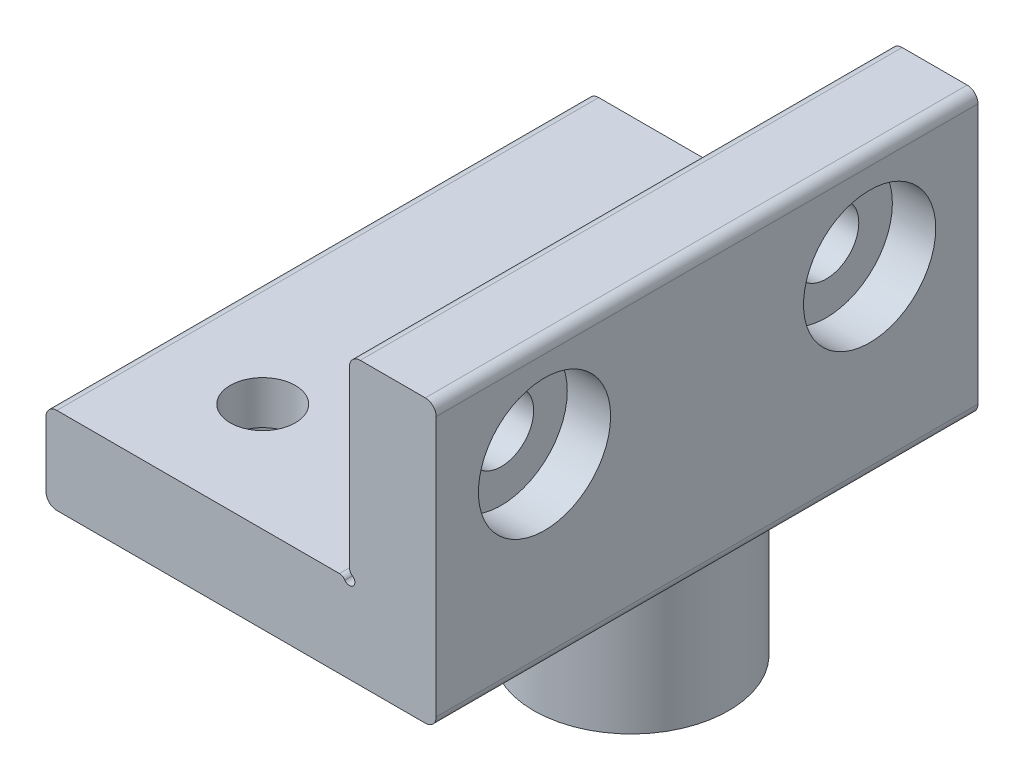
ISO-10303-21;
HEADER;
FILE_DESCRIPTION(('STEP AP214'),'2;1');
FILE_NAME('part.step','',(''),(''),'','','');
FILE_SCHEMA(('AUTOMOTIVE_DESIGN { 1 0 10303 214 1 1 1 1 }'));
ENDSEC;
DATA;
#1=APPLICATION_CONTEXT('core data for automotive mechanical design processes');
#2=APPLICATION_PROTOCOL_DEFINITION('international standard','automotive_design',2000,#1);
#3=PRODUCT_CONTEXT('',#1,'mechanical');
#4=PRODUCT('Part','Part','',(#3));
#5=PRODUCT_RELATED_PRODUCT_CATEGORY('part','',(#4));
#6=PRODUCT_DEFINITION_FORMATION('','',#4);
#7=PRODUCT_DEFINITION_CONTEXT('part definition',#1,'design');
#8=PRODUCT_DEFINITION('design','',#6,#7);
#9=PRODUCT_DEFINITION_SHAPE('','',#8);
#10=(LENGTH_UNIT() NAMED_UNIT(*) SI_UNIT(.MILLI.,.METRE.));
#11=(NAMED_UNIT(*) PLANE_ANGLE_UNIT() SI_UNIT($,.RADIAN.));
#12=(NAMED_UNIT(*) SI_UNIT($,.STERADIAN.) SOLID_ANGLE_UNIT());
#13=UNCERTAINTY_MEASURE_WITH_UNIT(LENGTH_MEASURE(1.E-05),#10,'distance_accuracy_value','');
#14=(GEOMETRIC_REPRESENTATION_CONTEXT(3) GLOBAL_UNCERTAINTY_ASSIGNED_CONTEXT((#13)) GLOBAL_UNIT_ASSIGNED_CONTEXT((#10,
#11,#12)) REPRESENTATION_CONTEXT('',''));
#15=CARTESIAN_POINT('',(0.,0.,0.));
#16=DIRECTION('',(0.,0.,1.));
#17=DIRECTION('',(1.,0.,0.));
#18=AXIS2_PLACEMENT_3D('',#15,#16,#17);
#19=CARTESIAN_POINT('',(-9.,9.001,20.));
#20=DIRECTION('',(0.,-1.,0.));
#21=DIRECTION('',(0.,0.,-1.));
#22=AXIS2_PLACEMENT_3D('',#19,#20,#21);
#23=CYLINDRICAL_SURFACE('',#22,1.5);
#24=CARTESIAN_POINT('',(-9.,0.,20.));
#25=DIRECTION('',(0.,-1.,0.));
#26=DIRECTION('',(1.,0.,0.));
#27=AXIS2_PLACEMENT_3D('',#24,#25,#26);
#28=CIRCLE('',#27,1.5);
#29=CARTESIAN_POINT('',(-7.5,0.,20.));
#30=VERTEX_POINT('',#29);
#31=EDGE_CURVE('E274',#30,#30,#28,.F.);
#32=ORIENTED_EDGE('',*,*,#31,.T.);
#33=EDGE_LOOP('',(#32));
#34=FACE_BOUND('',#33,.T.);
#35=CARTESIAN_POINT('',(-9.,-2.,20.));
#36=DIRECTION('',(0.,-1.,0.));
#37=DIRECTION('',(0.,0.,-1.));
#38=AXIS2_PLACEMENT_3D('',#35,#36,#37);
#39=CIRCLE('',#38,1.5);
#40=CARTESIAN_POINT('',(-9.,-2.,18.5));
#41=VERTEX_POINT('',#40);
#42=EDGE_CURVE('E189',#41,#41,#39,.F.);
#43=ORIENTED_EDGE('',*,*,#42,.F.);
#44=EDGE_LOOP('',(#43));
#45=FACE_BOUND('',#44,.T.);
#46=ADVANCED_FACE('F32',(#34,#45),#23,.F.);
#47=CARTESIAN_POINT('',(-14.001,4.5,20.));
#48=DIRECTION('',(1.,0.,0.));
#49=DIRECTION('',(0.,1.,0.));
#50=AXIS2_PLACEMENT_3D('',#47,#48,#49);
#51=CYLINDRICAL_SURFACE('',#50,1.5);
#52=CARTESIAN_POINT('',(0.,4.5,20.));
#53=DIRECTION('',(1.,0.,0.));
#54=DIRECTION('',(0.,1.,0.));
#55=AXIS2_PLACEMENT_3D('',#52,#53,#54);
#56=CIRCLE('',#55,1.5);
#57=CARTESIAN_POINT('',(0.,6.,20.));
#58=VERTEX_POINT('',#57);
#59=EDGE_CURVE('E157',#58,#58,#56,.F.);
#60=ORIENTED_EDGE('',*,*,#59,.T.);
#61=EDGE_LOOP('',(#60));
#62=FACE_BOUND('',#61,.T.);
#63=CARTESIAN_POINT('',(2.,4.5,20.));
#64=DIRECTION('',(1.,0.,0.));
#65=DIRECTION('',(0.,0.,-1.));
#66=AXIS2_PLACEMENT_3D('',#63,#64,#65);
#67=CIRCLE('',#66,1.5);
#68=CARTESIAN_POINT('',(2.,4.5,18.5));
#69=VERTEX_POINT('',#68);
#70=EDGE_CURVE('E185',#69,#69,#67,.F.);
#71=ORIENTED_EDGE('',*,*,#70,.F.);
#72=EDGE_LOOP('',(#71));
#73=FACE_BOUND('',#72,.T.);
#74=ADVANCED_FACE('F358',(#62,#73),#51,.F.);
#75=CARTESIAN_POINT('',(-14.001,4.5,5.));
#76=DIRECTION('',(1.,0.,0.));
#77=DIRECTION('',(0.,1.,0.));
#78=AXIS2_PLACEMENT_3D('',#75,#76,#77);
#79=CYLINDRICAL_SURFACE('',#78,1.5);
#80=CARTESIAN_POINT('',(0.,4.5,5.));
#81=DIRECTION('',(1.,0.,0.));
#82=DIRECTION('',(0.,1.,0.));
#83=AXIS2_PLACEMENT_3D('',#80,#81,#82);
#84=CIRCLE('',#83,1.5);
#85=CARTESIAN_POINT('',(0.,6.,5.));
#86=VERTEX_POINT('',#85);
#87=EDGE_CURVE('E283',#86,#86,#84,.F.);
#88=ORIENTED_EDGE('',*,*,#87,.T.);
#89=EDGE_LOOP('',(#88));
#90=FACE_BOUND('',#89,.T.);
#91=CARTESIAN_POINT('',(2.,4.5,5.));
#92=DIRECTION('',(1.,0.,0.));
#93=DIRECTION('',(0.,0.,-1.));
#94=AXIS2_PLACEMENT_3D('',#91,#92,#93);
#95=CIRCLE('',#94,1.5);
#96=CARTESIAN_POINT('',(2.,4.5,3.5));
#97=VERTEX_POINT('',#96);
#98=EDGE_CURVE('E182',#97,#97,#95,.F.);
#99=ORIENTED_EDGE('',*,*,#98,.F.);
#100=EDGE_LOOP('',(#99));
#101=FACE_BOUND('',#100,.T.);
#102=ADVANCED_FACE('F363',(#90,#101),#79,.F.);
#103=CARTESIAN_POINT('',(0.,9.,25.));
#104=DIRECTION('',(1.,0.,0.));
#105=DIRECTION('',(0.,1.,0.));
#106=AXIS2_PLACEMENT_3D('',#103,#104,#105);
#107=PLANE('',#106);
#108=ORIENTED_EDGE('',*,*,#87,.F.);
#109=EDGE_LOOP('',(#108));
#110=FACE_BOUND('',#109,.T.);
#111=ORIENTED_EDGE('',*,*,#59,.F.);
#112=EDGE_LOOP('',(#111));
#113=FACE_BOUND('',#112,.T.);
#114=DIRECTION('',(0.,-1.,0.));
#115=VECTOR('',#114,1.);
#116=CARTESIAN_POINT('',(0.,9.,25.));
#117=LINE('',#116,#115);
#118=CARTESIAN_POINT('',(0.,8.5,25.));
#119=VERTEX_POINT('',#118);
#120=CARTESIAN_POINT('',(0.,0.460977222864645,25.));
#121=VERTEX_POINT('',#120);
#122=EDGE_CURVE('E246',#119,#121,#117,.T.);
#123=ORIENTED_EDGE('',*,*,#122,.F.);
#124=DIRECTION('',(0.,0.,-1.));
#125=VECTOR('',#124,1.);
#126=CARTESIAN_POINT('',(0.,8.5,25.));
#127=LINE('',#126,#125);
#128=CARTESIAN_POINT('',(0.,8.5,0.));
#129=VERTEX_POINT('',#128);
#130=EDGE_CURVE('E225',#119,#129,#127,.T.);
#131=ORIENTED_EDGE('',*,*,#130,.T.);
#132=DIRECTION('',(0.,-1.,0.));
#133=VECTOR('',#132,1.);
#134=CARTESIAN_POINT('',(0.,9.,0.));
#135=LINE('',#134,#133);
#136=CARTESIAN_POINT('',(0.,0.460977222864645,0.));
#137=VERTEX_POINT('',#136);
#138=EDGE_CURVE('E261',#129,#137,#135,.T.);
#139=ORIENTED_EDGE('',*,*,#138,.T.);
#140=DIRECTION('',(0.,0.,1.));
#141=VECTOR('',#140,1.);
#142=CARTESIAN_POINT('',(0.,0.460977222864645,25.));
#143=LINE('',#142,#141);
#144=EDGE_CURVE('E173',#137,#121,#143,.T.);
#145=ORIENTED_EDGE('',*,*,#144,.T.);
#146=EDGE_LOOP('',(#123,#131,#139,#145));
#147=FACE_BOUND('',#146,.T.);
#148=ADVANCED_FACE('F383',(#110,#113,#147),#107,.F.);
#149=CARTESIAN_POINT('',(0.,0.,25.));
#150=DIRECTION('',(0.,-1.,0.));
#151=DIRECTION('',(1.,0.,0.));
#152=AXIS2_PLACEMENT_3D('',#149,#150,#151);
#153=PLANE('',#152);
#154=ORIENTED_EDGE('',*,*,#31,.F.);
#155=EDGE_LOOP('',(#154));
#156=FACE_BOUND('',#155,.T.);
#157=DIRECTION('',(-1.,0.,0.));
#158=VECTOR('',#157,1.);
#159=CARTESIAN_POINT('',(0.,0.,0.));
#160=LINE('',#159,#158);
#161=CARTESIAN_POINT('',(-0.460977222864644,0.,0.));
#162=VERTEX_POINT('',#161);
#163=CARTESIAN_POINT('',(-13.5,0.,0.));
#164=VERTEX_POINT('',#163);
#165=EDGE_CURVE('E142',#162,#164,#160,.T.);
#166=ORIENTED_EDGE('',*,*,#165,.T.);
#167=DIRECTION('',(0.,0.,-1.));
#168=VECTOR('',#167,1.);
#169=CARTESIAN_POINT('',(-13.5,0.,25.));
#170=LINE('',#169,#168);
#171=CARTESIAN_POINT('',(-13.5,0.,25.));
#172=VERTEX_POINT('',#171);
#173=EDGE_CURVE('E233',#164,#172,#170,.F.);
#174=ORIENTED_EDGE('',*,*,#173,.T.);
#175=DIRECTION('',(-1.,0.,0.));
#176=VECTOR('',#175,1.);
#177=CARTESIAN_POINT('',(0.,0.,25.));
#178=LINE('',#177,#176);
#179=CARTESIAN_POINT('',(-0.460977222864644,0.,25.));
#180=VERTEX_POINT('',#179);
#181=EDGE_CURVE('E239',#180,#172,#178,.T.);
#182=ORIENTED_EDGE('',*,*,#181,.F.);
#183=DIRECTION('',(0.,0.,1.));
#184=VECTOR('',#183,1.);
#185=CARTESIAN_POINT('',(-0.460977222864644,0.,25.));
#186=LINE('',#185,#184);
#187=EDGE_CURVE('E179',#180,#162,#186,.F.);
#188=ORIENTED_EDGE('',*,*,#187,.T.);
#189=EDGE_LOOP('',(#166,#174,#182,#188));
#190=FACE_BOUND('',#189,.T.);
#191=ADVANCED_FACE('F238',(#156,#190),#153,.F.);
#192=CARTESIAN_POINT('',(-14.,0.,25.));
#193=DIRECTION('',(1.,0.,0.));
#194=DIRECTION('',(0.,0.,-1.));
#195=AXIS2_PLACEMENT_3D('',#192,#193,#194);
#196=PLANE('',#195);
#197=DIRECTION('',(0.,-1.,0.));
#198=VECTOR('',#197,1.);
#199=CARTESIAN_POINT('',(-14.,0.,25.));
#200=LINE('',#199,#198);
#201=CARTESIAN_POINT('',(-14.,-0.500000000000002,25.));
#202=VERTEX_POINT('',#201);
#203=CARTESIAN_POINT('',(-14.,-3.5,25.));
#204=VERTEX_POINT('',#203);
#205=EDGE_CURVE('E245',#202,#204,#200,.T.);
#206=ORIENTED_EDGE('',*,*,#205,.F.);
#207=DIRECTION('',(0.,0.,-1.));
#208=VECTOR('',#207,1.);
#209=CARTESIAN_POINT('',(-14.,-0.500000000000002,25.));
#210=LINE('',#209,#208);
#211=CARTESIAN_POINT('',(-14.,-0.500000000000002,0.));
#212=VERTEX_POINT('',#211);
#213=EDGE_CURVE('E230',#202,#212,#210,.T.);
#214=ORIENTED_EDGE('',*,*,#213,.T.);
#215=DIRECTION('',(0.,-1.,0.));
#216=VECTOR('',#215,1.);
#217=CARTESIAN_POINT('',(-14.,0.,0.));
#218=LINE('',#217,#216);
#219=CARTESIAN_POINT('',(-14.,-3.5,0.));
#220=VERTEX_POINT('',#219);
#221=EDGE_CURVE('E254',#212,#220,#218,.T.);
#222=ORIENTED_EDGE('',*,*,#221,.T.);
#223=DIRECTION('',(0.,0.,-1.));
#224=VECTOR('',#223,1.);
#225=CARTESIAN_POINT('',(-14.,-3.5,25.));
#226=LINE('',#225,#224);
#227=EDGE_CURVE('E228',#220,#204,#226,.F.);
#228=ORIENTED_EDGE('',*,*,#227,.T.);
#229=EDGE_LOOP('',(#206,#214,#222,#228));
#230=FACE_BOUND('',#229,.T.);
#231=ADVANCED_FACE('F253',(#230),#196,.F.);
#232=CARTESIAN_POINT('',(-14.,-4.,25.));
#233=DIRECTION('',(0.,1.,0.));
#234=DIRECTION('',(0.,0.,1.));
#235=AXIS2_PLACEMENT_3D('',#232,#233,#234);
#236=PLANE('',#235);
#237=CARTESIAN_POINT('',(-5.,-4.,7.));
#238=DIRECTION('',(0.,1.,0.));
#239=DIRECTION('',(0.,0.,1.));
#240=AXIS2_PLACEMENT_3D('',#237,#238,#239);
#241=CIRCLE('',#240,4.5);
#242=CARTESIAN_POINT('',(-5.,-4.,11.5));
#243=VERTEX_POINT('',#242);
#244=EDGE_CURVE('E181',#243,#243,#241,.F.);
#245=ORIENTED_EDGE('',*,*,#244,.F.);
#246=EDGE_LOOP('',(#245));
#247=FACE_BOUND('',#246,.T.);
#248=CARTESIAN_POINT('',(-9.,-4.,20.));
#249=DIRECTION('',(0.,-1.,0.));
#250=DIRECTION('',(0.,0.,-1.));
#251=AXIS2_PLACEMENT_3D('',#248,#249,#250);
#252=CIRCLE('',#251,3.05);
#253=CARTESIAN_POINT('',(-9.,-4.,16.95));
#254=VERTEX_POINT('',#253);
#255=EDGE_CURVE('E303',#254,#254,#252,.T.);
#256=ORIENTED_EDGE('',*,*,#255,.F.);
#257=EDGE_LOOP('',(#256));
#258=FACE_BOUND('',#257,.T.);
#259=DIRECTION('',(1.,0.,0.));
#260=VECTOR('',#259,1.);
#261=CARTESIAN_POINT('',(-14.,-4.,25.));
#262=LINE('',#261,#260);
#263=CARTESIAN_POINT('',(-13.5,-4.,25.));
#264=VERTEX_POINT('',#263);
#265=CARTESIAN_POINT('',(3.5,-4.,25.));
#266=VERTEX_POINT('',#265);
#267=EDGE_CURVE('E278',#264,#266,#262,.T.);
#268=ORIENTED_EDGE('',*,*,#267,.F.);
#269=DIRECTION('',(0.,0.,-1.));
#270=VECTOR('',#269,1.);
#271=CARTESIAN_POINT('',(-13.5,-4.,25.));
#272=LINE('',#271,#270);
#273=CARTESIAN_POINT('',(-13.5,-4.,0.));
#274=VERTEX_POINT('',#273);
#275=EDGE_CURVE('E11',#264,#274,#272,.T.);
#276=ORIENTED_EDGE('',*,*,#275,.T.);
#277=DIRECTION('',(1.,0.,0.));
#278=VECTOR('',#277,1.);
#279=CARTESIAN_POINT('',(-14.,-4.,0.));
#280=LINE('',#279,#278);
#281=CARTESIAN_POINT('',(3.5,-4.,0.));
#282=VERTEX_POINT('',#281);
#283=EDGE_CURVE('E257',#274,#282,#280,.T.);
#284=ORIENTED_EDGE('',*,*,#283,.T.);
#285=DIRECTION('',(0.,0.,-1.));
#286=VECTOR('',#285,1.);
#287=CARTESIAN_POINT('',(3.5,-4.,25.));
#288=LINE('',#287,#286);
#289=EDGE_CURVE('E40',#282,#266,#288,.F.);
#290=ORIENTED_EDGE('',*,*,#289,.T.);
#291=EDGE_LOOP('',(#268,#276,#284,#290));
#292=FACE_BOUND('',#291,.T.);
#293=ADVANCED_FACE('F339',(#247,#258,#292),#236,.F.);
#294=CARTESIAN_POINT('',(4.,-4.,25.));
#295=DIRECTION('',(-1.,0.,0.));
#296=DIRECTION('',(0.,0.,1.));
#297=AXIS2_PLACEMENT_3D('',#294,#295,#296);
#298=PLANE('',#297);
#299=CARTESIAN_POINT('',(4.,4.5,20.));
#300=DIRECTION('',(1.,0.,0.));
#301=DIRECTION('',(0.,0.,-1.));
#302=AXIS2_PLACEMENT_3D('',#299,#300,#301);
#303=CIRCLE('',#302,3.05);
#304=CARTESIAN_POINT('',(4.,4.5,16.95));
#305=VERTEX_POINT('',#304);
#306=EDGE_CURVE('E298',#305,#305,#303,.T.);
#307=ORIENTED_EDGE('',*,*,#306,.F.);
#308=EDGE_LOOP('',(#307));
#309=FACE_BOUND('',#308,.T.);
#310=CARTESIAN_POINT('',(4.,4.5,5.));
#311=DIRECTION('',(1.,0.,0.));
#312=DIRECTION('',(0.,0.,-1.));
#313=AXIS2_PLACEMENT_3D('',#310,#311,#312);
#314=CIRCLE('',#313,3.05);
#315=CARTESIAN_POINT('',(4.,4.5,1.95));
#316=VERTEX_POINT('',#315);
#317=EDGE_CURVE('E192',#316,#316,#314,.T.);
#318=ORIENTED_EDGE('',*,*,#317,.F.);
#319=EDGE_LOOP('',(#318));
#320=FACE_BOUND('',#319,.T.);
#321=DIRECTION('',(0.,1.,0.));
#322=VECTOR('',#321,1.);
#323=CARTESIAN_POINT('',(4.,-4.,0.));
#324=LINE('',#323,#322);
#325=CARTESIAN_POINT('',(4.,-3.5,0.));
#326=VERTEX_POINT('',#325);
#327=CARTESIAN_POINT('',(4.,8.5,0.));
#328=VERTEX_POINT('',#327);
#329=EDGE_CURVE('E259',#326,#328,#324,.T.);
#330=ORIENTED_EDGE('',*,*,#329,.T.);
#331=DIRECTION('',(0.,0.,-1.));
#332=VECTOR('',#331,1.);
#333=CARTESIAN_POINT('',(4.,8.5,25.));
#334=LINE('',#333,#332);
#335=CARTESIAN_POINT('',(4.,8.5,25.));
#336=VERTEX_POINT('',#335);
#337=EDGE_CURVE('E214',#328,#336,#334,.F.);
#338=ORIENTED_EDGE('',*,*,#337,.T.);
#339=DIRECTION('',(0.,1.,0.));
#340=VECTOR('',#339,1.);
#341=CARTESIAN_POINT('',(4.,-4.,25.));
#342=LINE('',#341,#340);
#343=CARTESIAN_POINT('',(4.,-3.5,25.));
#344=VERTEX_POINT('',#343);
#345=EDGE_CURVE('E166',#344,#336,#342,.T.);
#346=ORIENTED_EDGE('',*,*,#345,.F.);
#347=DIRECTION('',(0.,0.,-1.));
#348=VECTOR('',#347,1.);
#349=CARTESIAN_POINT('',(4.,-3.5,25.));
#350=LINE('',#349,#348);
#351=EDGE_CURVE('E211',#344,#326,#350,.T.);
#352=ORIENTED_EDGE('',*,*,#351,.T.);
#353=EDGE_LOOP('',(#330,#338,#346,#352));
#354=FACE_BOUND('',#353,.T.);
#355=ADVANCED_FACE('F342',(#309,#320,#354),#298,.F.);
#356=CARTESIAN_POINT('',(4.,9.,25.));
#357=DIRECTION('',(0.,-1.,0.));
#358=DIRECTION('',(1.,0.,0.));
#359=AXIS2_PLACEMENT_3D('',#356,#357,#358);
#360=PLANE('',#359);
#361=DIRECTION('',(-1.,0.,0.));
#362=VECTOR('',#361,1.);
#363=CARTESIAN_POINT('',(4.,9.,25.));
#364=LINE('',#363,#362);
#365=CARTESIAN_POINT('',(3.5,9.,25.));
#366=VERTEX_POINT('',#365);
#367=CARTESIAN_POINT('',(0.499999999999999,9.,25.));
#368=VERTEX_POINT('',#367);
#369=EDGE_CURVE('E162',#366,#368,#364,.T.);
#370=ORIENTED_EDGE('',*,*,#369,.F.);
#371=DIRECTION('',(0.,0.,-1.));
#372=VECTOR('',#371,1.);
#373=CARTESIAN_POINT('',(3.5,9.,25.));
#374=LINE('',#373,#372);
#375=CARTESIAN_POINT('',(3.5,9.,0.));
#376=VERTEX_POINT('',#375);
#377=EDGE_CURVE('E198',#366,#376,#374,.T.);
#378=ORIENTED_EDGE('',*,*,#377,.T.);
#379=DIRECTION('',(-1.,0.,0.));
#380=VECTOR('',#379,1.);
#381=CARTESIAN_POINT('',(4.,9.,0.));
#382=LINE('',#381,#380);
#383=CARTESIAN_POINT('',(0.499999999999999,9.,0.));
#384=VERTEX_POINT('',#383);
#385=EDGE_CURVE('E169',#376,#384,#382,.T.);
#386=ORIENTED_EDGE('',*,*,#385,.T.);
#387=DIRECTION('',(0.,0.,-1.));
#388=VECTOR('',#387,1.);
#389=CARTESIAN_POINT('',(0.499999999999999,9.,25.));
#390=LINE('',#389,#388);
#391=EDGE_CURVE('E196',#384,#368,#390,.F.);
#392=ORIENTED_EDGE('',*,*,#391,.T.);
#393=EDGE_LOOP('',(#370,#378,#386,#392));
#394=FACE_BOUND('',#393,.T.);
#395=ADVANCED_FACE('F371',(#394),#360,.F.);
#396=CARTESIAN_POINT('',(0.,0.,25.));
#397=DIRECTION('',(0.,0.,-1.));
#398=DIRECTION('',(-1.,0.,0.));
#399=AXIS2_PLACEMENT_3D('',#396,#397,#398);
#400=PLANE('',#399);
#401=ORIENTED_EDGE('',*,*,#345,.T.);
#402=CARTESIAN_POINT('',(3.5,8.5,25.));
#403=DIRECTION('',(0.,0.,-1.));
#404=DIRECTION('',(-1.,0.,0.));
#405=AXIS2_PLACEMENT_3D('',#402,#403,#404);
#406=CIRCLE('',#405,0.5);
#407=EDGE_CURVE('E223',#336,#366,#406,.F.);
#408=ORIENTED_EDGE('',*,*,#407,.T.);
#409=ORIENTED_EDGE('',*,*,#369,.T.);
#410=CARTESIAN_POINT('',(0.499999999999999,8.5,25.));
#411=DIRECTION('',(0.,0.,-1.));
#412=DIRECTION('',(-1.,0.,0.));
#413=AXIS2_PLACEMENT_3D('',#410,#411,#412);
#414=CIRCLE('',#413,0.5);
#415=EDGE_CURVE('E221',#368,#119,#414,.F.);
#416=ORIENTED_EDGE('',*,*,#415,.T.);
#417=ORIENTED_EDGE('',*,*,#122,.T.);
#418=CARTESIAN_POINT('',(0.3,0.460977222864644,25.));
#419=DIRECTION('',(0.,0.,-1.));
#420=DIRECTION('',(-1.,0.,0.));
#421=AXIS2_PLACEMENT_3D('',#418,#419,#420);
#422=CIRCLE('',#421,0.3);
#423=CARTESIAN_POINT('',(0.136363636363636,0.209535101302111,25.));
#424=VERTEX_POINT('',#423);
#425=EDGE_CURVE('E177',#121,#424,#422,.F.);
#426=ORIENTED_EDGE('',*,*,#425,.T.);
#427=CARTESIAN_POINT('',(0.,0.,25.));
#428=DIRECTION('',(0.,0.,1.));
#429=DIRECTION('',(1.,0.,0.));
#430=AXIS2_PLACEMENT_3D('',#427,#428,#429);
#431=CIRCLE('',#430,0.25);
#432=CARTESIAN_POINT('',(-0.209535101302111,-0.136363636363636,25.));
#433=VERTEX_POINT('',#432);
#434=EDGE_CURVE('E158',#433,#424,#431,.T.);
#435=ORIENTED_EDGE('',*,*,#434,.F.);
#436=CARTESIAN_POINT('',(-0.460977222864644,-0.3,25.));
#437=DIRECTION('',(0.,0.,-1.));
#438=DIRECTION('',(-1.,0.,0.));
#439=AXIS2_PLACEMENT_3D('',#436,#437,#438);
#440=CIRCLE('',#439,0.3);
#441=EDGE_CURVE('E161',#433,#180,#440,.F.);
#442=ORIENTED_EDGE('',*,*,#441,.T.);
#443=ORIENTED_EDGE('',*,*,#181,.T.);
#444=CARTESIAN_POINT('',(-13.5,-0.500000000000002,25.));
#445=DIRECTION('',(0.,0.,-1.));
#446=DIRECTION('',(-1.,0.,0.));
#447=AXIS2_PLACEMENT_3D('',#444,#445,#446);
#448=CIRCLE('',#447,0.5);
#449=EDGE_CURVE('E219',#172,#202,#448,.F.);
#450=ORIENTED_EDGE('',*,*,#449,.T.);
#451=ORIENTED_EDGE('',*,*,#205,.T.);
#452=CARTESIAN_POINT('',(-13.5,-3.5,25.));
#453=DIRECTION('',(0.,0.,-1.));
#454=DIRECTION('',(-1.,0.,0.));
#455=AXIS2_PLACEMENT_3D('',#452,#453,#454);
#456=CIRCLE('',#455,0.5);
#457=EDGE_CURVE('E53',#204,#264,#456,.F.);
#458=ORIENTED_EDGE('',*,*,#457,.T.);
#459=ORIENTED_EDGE('',*,*,#267,.T.);
#460=CARTESIAN_POINT('',(3.5,-3.5,25.));
#461=DIRECTION('',(0.,0.,-1.));
#462=DIRECTION('',(-1.,0.,0.));
#463=AXIS2_PLACEMENT_3D('',#460,#461,#462);
#464=CIRCLE('',#463,0.5);
#465=EDGE_CURVE('E216',#266,#344,#464,.F.);
#466=ORIENTED_EDGE('',*,*,#465,.T.);
#467=EDGE_LOOP('',(#401,#408,#409,#416,#417,#426,#435,#442,#443,#450,#451,#458,#459,#466));
#468=FACE_BOUND('',#467,.T.);
#469=ADVANCED_FACE('F243',(#468),#400,.F.);
#470=CARTESIAN_POINT('',(0.,0.,0.));
#471=DIRECTION('',(0.,0.,-1.));
#472=DIRECTION('',(-1.,0.,0.));
#473=AXIS2_PLACEMENT_3D('',#470,#471,#472);
#474=PLANE('',#473);
#475=ORIENTED_EDGE('',*,*,#385,.F.);
#476=CARTESIAN_POINT('',(3.5,8.5,0.));
#477=DIRECTION('',(0.,0.,-1.));
#478=DIRECTION('',(-1.,0.,0.));
#479=AXIS2_PLACEMENT_3D('',#476,#477,#478);
#480=CIRCLE('',#479,0.5);
#481=EDGE_CURVE('E209',#376,#328,#480,.T.);
#482=ORIENTED_EDGE('',*,*,#481,.T.);
#483=ORIENTED_EDGE('',*,*,#329,.F.);
#484=CARTESIAN_POINT('',(3.5,-3.5,0.));
#485=DIRECTION('',(0.,0.,-1.));
#486=DIRECTION('',(-1.,0.,0.));
#487=AXIS2_PLACEMENT_3D('',#484,#485,#486);
#488=CIRCLE('',#487,0.5);
#489=EDGE_CURVE('E201',#326,#282,#488,.T.);
#490=ORIENTED_EDGE('',*,*,#489,.T.);
#491=ORIENTED_EDGE('',*,*,#283,.F.);
#492=CARTESIAN_POINT('',(-13.5,-3.5,0.));
#493=DIRECTION('',(0.,0.,-1.));
#494=DIRECTION('',(-1.,0.,0.));
#495=AXIS2_PLACEMENT_3D('',#492,#493,#494);
#496=CIRCLE('',#495,0.5);
#497=EDGE_CURVE('E203',#274,#220,#496,.T.);
#498=ORIENTED_EDGE('',*,*,#497,.T.);
#499=ORIENTED_EDGE('',*,*,#221,.F.);
#500=CARTESIAN_POINT('',(-13.5,-0.500000000000002,0.));
#501=DIRECTION('',(0.,0.,-1.));
#502=DIRECTION('',(-1.,0.,0.));
#503=AXIS2_PLACEMENT_3D('',#500,#501,#502);
#504=CIRCLE('',#503,0.5);
#505=EDGE_CURVE('E205',#212,#164,#504,.T.);
#506=ORIENTED_EDGE('',*,*,#505,.T.);
#507=ORIENTED_EDGE('',*,*,#165,.F.);
#508=CARTESIAN_POINT('',(-0.460977222864644,-0.3,0.));
#509=DIRECTION('',(0.,0.,-1.));
#510=DIRECTION('',(-1.,0.,0.));
#511=AXIS2_PLACEMENT_3D('',#508,#509,#510);
#512=CIRCLE('',#511,0.3);
#513=CARTESIAN_POINT('',(-0.209535101302111,-0.136363636363636,0.));
#514=VERTEX_POINT('',#513);
#515=EDGE_CURVE('E135',#162,#514,#512,.T.);
#516=ORIENTED_EDGE('',*,*,#515,.T.);
#517=CARTESIAN_POINT('',(0.,0.,0.));
#518=DIRECTION('',(0.,0.,-1.));
#519=DIRECTION('',(-1.,0.,0.));
#520=AXIS2_PLACEMENT_3D('',#517,#518,#519);
#521=CIRCLE('',#520,0.25);
#522=CARTESIAN_POINT('',(0.136363636363636,0.209535101302111,0.));
#523=VERTEX_POINT('',#522);
#524=EDGE_CURVE('E140',#514,#523,#521,.F.);
#525=ORIENTED_EDGE('',*,*,#524,.T.);
#526=CARTESIAN_POINT('',(0.3,0.460977222864644,0.));
#527=DIRECTION('',(0.,0.,-1.));
#528=DIRECTION('',(-1.,0.,0.));
#529=AXIS2_PLACEMENT_3D('',#526,#527,#528);
#530=CIRCLE('',#529,0.3);
#531=EDGE_CURVE('E146',#523,#137,#530,.T.);
#532=ORIENTED_EDGE('',*,*,#531,.T.);
#533=ORIENTED_EDGE('',*,*,#138,.F.);
#534=CARTESIAN_POINT('',(0.499999999999999,8.5,0.));
#535=DIRECTION('',(0.,0.,-1.));
#536=DIRECTION('',(-1.,0.,0.));
#537=AXIS2_PLACEMENT_3D('',#534,#535,#536);
#538=CIRCLE('',#537,0.5);
#539=EDGE_CURVE('E207',#129,#384,#538,.T.);
#540=ORIENTED_EDGE('',*,*,#539,.T.);
#541=EDGE_LOOP('',(#475,#482,#483,#490,#491,#498,#499,#506,#507,#516,#525,#532,#533,#540));
#542=FACE_BOUND('',#541,.T.);
#543=ADVANCED_FACE('F138',(#542),#474,.T.);
#544=CARTESIAN_POINT('',(0.,0.,-0.001000000000001));
#545=DIRECTION('',(0.,0.,1.));
#546=DIRECTION('',(1.,0.,0.));
#547=AXIS2_PLACEMENT_3D('',#544,#545,#546);
#548=CYLINDRICAL_SURFACE('',#547,0.25);
#549=ORIENTED_EDGE('',*,*,#434,.T.);
#550=DIRECTION('',(0.,0.,1.));
#551=VECTOR('',#550,1.);
#552=CARTESIAN_POINT('',(0.136363636363636,0.209535101302111,-0.001000000000001));
#553=LINE('',#552,#551);
#554=EDGE_CURVE('E147',#424,#523,#553,.F.);
#555=ORIENTED_EDGE('',*,*,#554,.T.);
#556=ORIENTED_EDGE('',*,*,#524,.F.);
#557=DIRECTION('',(0.,0.,1.));
#558=VECTOR('',#557,1.);
#559=CARTESIAN_POINT('',(-0.209535101302111,-0.136363636363636,-0.001000000000001));
#560=LINE('',#559,#558);
#561=EDGE_CURVE('E154',#514,#433,#560,.T.);
#562=ORIENTED_EDGE('',*,*,#561,.T.);
#563=EDGE_LOOP('',(#549,#555,#556,#562));
#564=FACE_BOUND('',#563,.T.);
#565=ADVANCED_FACE('F153',(#564),#548,.F.);
#566=CARTESIAN_POINT('',(0.3,0.460977222864644,-0.001000000000001));
#567=DIRECTION('',(0.,0.,1.));
#568=DIRECTION('',(1.,0.,0.));
#569=AXIS2_PLACEMENT_3D('',#566,#567,#568);
#570=CYLINDRICAL_SURFACE('',#569,0.3);
#571=ORIENTED_EDGE('',*,*,#425,.F.);
#572=ORIENTED_EDGE('',*,*,#144,.F.);
#573=ORIENTED_EDGE('',*,*,#531,.F.);
#574=ORIENTED_EDGE('',*,*,#554,.F.);
#575=EDGE_LOOP('',(#571,#572,#573,#574));
#576=FACE_BOUND('',#575,.T.);
#577=ADVANCED_FACE('F388',(#576),#570,.T.);
#578=CARTESIAN_POINT('',(-0.460977222864644,-0.3,-0.001000000000001));
#579=DIRECTION('',(0.,0.,1.));
#580=DIRECTION('',(1.,0.,0.));
#581=AXIS2_PLACEMENT_3D('',#578,#579,#580);
#582=CYLINDRICAL_SURFACE('',#581,0.3);
#583=ORIENTED_EDGE('',*,*,#515,.F.);
#584=ORIENTED_EDGE('',*,*,#187,.F.);
#585=ORIENTED_EDGE('',*,*,#441,.F.);
#586=ORIENTED_EDGE('',*,*,#561,.F.);
#587=EDGE_LOOP('',(#583,#584,#585,#586));
#588=FACE_BOUND('',#587,.T.);
#589=ADVANCED_FACE('F160',(#588),#582,.T.);
#590=CARTESIAN_POINT('',(2.,4.5,5.));
#591=DIRECTION('',(1.,0.,0.));
#592=DIRECTION('',(0.,0.,-1.));
#593=AXIS2_PLACEMENT_3D('',#590,#591,#592);
#594=PLANE('',#593);
#595=CARTESIAN_POINT('',(2.,4.5,5.));
#596=DIRECTION('',(1.,0.,0.));
#597=DIRECTION('',(0.,0.,-1.));
#598=AXIS2_PLACEMENT_3D('',#595,#596,#597);
#599=CIRCLE('',#598,3.05);
#600=CARTESIAN_POINT('',(2.,4.5,1.95));
#601=VERTEX_POINT('',#600);
#602=EDGE_CURVE('E295',#601,#601,#599,.T.);
#603=ORIENTED_EDGE('',*,*,#602,.T.);
#604=EDGE_LOOP('',(#603));
#605=FACE_BOUND('',#604,.T.);
#606=ORIENTED_EDGE('',*,*,#98,.T.);
#607=EDGE_LOOP('',(#606));
#608=FACE_BOUND('',#607,.T.);
#609=ADVANCED_FACE('F394',(#605,#608),#594,.T.);
#610=CARTESIAN_POINT('',(2.,4.5,5.));
#611=DIRECTION('',(1.,0.,0.));
#612=DIRECTION('',(0.,0.,-1.));
#613=AXIS2_PLACEMENT_3D('',#610,#611,#612);
#614=CYLINDRICAL_SURFACE('',#613,3.05);
#615=ORIENTED_EDGE('',*,*,#602,.F.);
#616=EDGE_LOOP('',(#615));
#617=FACE_BOUND('',#616,.T.);
#618=ORIENTED_EDGE('',*,*,#317,.T.);
#619=EDGE_LOOP('',(#618));
#620=FACE_BOUND('',#619,.T.);
#621=ADVANCED_FACE('F497',(#617,#620),#614,.F.);
#622=CARTESIAN_POINT('',(2.,4.5,20.));
#623=DIRECTION('',(1.,0.,0.));
#624=DIRECTION('',(0.,0.,-1.));
#625=AXIS2_PLACEMENT_3D('',#622,#623,#624);
#626=PLANE('',#625);
#627=CARTESIAN_POINT('',(2.,4.5,20.));
#628=DIRECTION('',(1.,0.,0.));
#629=DIRECTION('',(0.,0.,-1.));
#630=AXIS2_PLACEMENT_3D('',#627,#628,#629);
#631=CIRCLE('',#630,3.05);
#632=CARTESIAN_POINT('',(2.,4.5,16.95));
#633=VERTEX_POINT('',#632);
#634=EDGE_CURVE('E186',#633,#633,#631,.T.);
#635=ORIENTED_EDGE('',*,*,#634,.T.);
#636=EDGE_LOOP('',(#635));
#637=FACE_BOUND('',#636,.T.);
#638=ORIENTED_EDGE('',*,*,#70,.T.);
#639=EDGE_LOOP('',(#638));
#640=FACE_BOUND('',#639,.T.);
#641=ADVANCED_FACE('F488',(#637,#640),#626,.T.);
#642=CARTESIAN_POINT('',(2.,4.5,20.));
#643=DIRECTION('',(1.,0.,0.));
#644=DIRECTION('',(0.,0.,-1.));
#645=AXIS2_PLACEMENT_3D('',#642,#643,#644);
#646=CYLINDRICAL_SURFACE('',#645,3.05);
#647=ORIENTED_EDGE('',*,*,#634,.F.);
#648=EDGE_LOOP('',(#647));
#649=FACE_BOUND('',#648,.T.);
#650=ORIENTED_EDGE('',*,*,#306,.T.);
#651=EDGE_LOOP('',(#650));
#652=FACE_BOUND('',#651,.T.);
#653=ADVANCED_FACE('F475',(#649,#652),#646,.F.);
#654=CARTESIAN_POINT('',(-9.,-2.,20.));
#655=DIRECTION('',(0.,-1.,0.));
#656=DIRECTION('',(0.,0.,-1.));
#657=AXIS2_PLACEMENT_3D('',#654,#655,#656);
#658=PLANE('',#657);
#659=CARTESIAN_POINT('',(-9.,-2.,20.));
#660=DIRECTION('',(0.,-1.,0.));
#661=DIRECTION('',(0.,0.,-1.));
#662=AXIS2_PLACEMENT_3D('',#659,#660,#661);
#663=CIRCLE('',#662,3.05);
#664=CARTESIAN_POINT('',(-9.,-2.,16.95));
#665=VERTEX_POINT('',#664);
#666=EDGE_CURVE('E193',#665,#665,#663,.T.);
#667=ORIENTED_EDGE('',*,*,#666,.T.);
#668=EDGE_LOOP('',(#667));
#669=FACE_BOUND('',#668,.T.);
#670=ORIENTED_EDGE('',*,*,#42,.T.);
#671=EDGE_LOOP('',(#670));
#672=FACE_BOUND('',#671,.T.);
#673=ADVANCED_FACE('F466',(#669,#672),#658,.T.);
#674=CARTESIAN_POINT('',(-9.,-2.,20.));
#675=DIRECTION('',(0.,-1.,0.));
#676=DIRECTION('',(0.,0.,-1.));
#677=AXIS2_PLACEMENT_3D('',#674,#675,#676);
#678=CYLINDRICAL_SURFACE('',#677,3.05);
#679=ORIENTED_EDGE('',*,*,#666,.F.);
#680=EDGE_LOOP('',(#679));
#681=FACE_BOUND('',#680,.T.);
#682=ORIENTED_EDGE('',*,*,#255,.T.);
#683=EDGE_LOOP('',(#682));
#684=FACE_BOUND('',#683,.T.);
#685=ADVANCED_FACE('F335',(#681,#684),#678,.F.);
#686=CARTESIAN_POINT('',(-5.,-14.5,7.));
#687=DIRECTION('',(0.,1.,0.));
#688=DIRECTION('',(0.,0.,1.));
#689=AXIS2_PLACEMENT_3D('',#686,#687,#688);
#690=CYLINDRICAL_SURFACE('',#689,4.5);
#691=CARTESIAN_POINT('',(-5.,-14.5,7.));
#692=DIRECTION('',(0.,-1.,0.));
#693=DIRECTION('',(0.,0.,-1.));
#694=AXIS2_PLACEMENT_3D('',#691,#692,#693);
#695=CIRCLE('',#694,4.5);
#696=CARTESIAN_POINT('',(-5.,-14.5,11.5));
#697=VERTEX_POINT('',#696);
#698=EDGE_CURVE('E306',#697,#697,#695,.T.);
#699=CARTESIAN_POINT('',(-5.,-14.5,11.5));
#700=CARTESIAN_POINT('',(-5.,-14.390625,11.5));
#701=CARTESIAN_POINT('',(-5.,-14.28125,11.5));
#702=CARTESIAN_POINT('',(-5.,-14.0625,11.5));
#703=CARTESIAN_POINT('',(-5.,-13.953125,11.5));
#704=CARTESIAN_POINT('',(-5.,-13.734375,11.5));
#705=CARTESIAN_POINT('',(-5.,-13.625,11.5));
#706=CARTESIAN_POINT('',(-5.,-13.40625,11.5));
#707=CARTESIAN_POINT('',(-5.,-13.296875,11.5));
#708=CARTESIAN_POINT('',(-5.,-13.078125,11.5));
#709=CARTESIAN_POINT('',(-5.,-12.96875,11.5));
#710=CARTESIAN_POINT('',(-5.,-12.75,11.5));
#711=CARTESIAN_POINT('',(-5.,-12.640625,11.5));
#712=CARTESIAN_POINT('',(-5.,-12.421875,11.5));
#713=CARTESIAN_POINT('',(-5.,-12.3125,11.5));
#714=CARTESIAN_POINT('',(-5.,-12.09375,11.5));
#715=CARTESIAN_POINT('',(-5.,-11.984375,11.5));
#716=CARTESIAN_POINT('',(-5.,-11.765625,11.5));
#717=CARTESIAN_POINT('',(-5.,-11.65625,11.5));
#718=CARTESIAN_POINT('',(-5.,-11.4375,11.5));
#719=CARTESIAN_POINT('',(-5.,-11.328125,11.5));
#720=CARTESIAN_POINT('',(-5.,-11.109375,11.5));
#721=CARTESIAN_POINT('',(-5.,-11.,11.5));
#722=CARTESIAN_POINT('',(-5.,-10.78125,11.5));
#723=CARTESIAN_POINT('',(-5.,-10.671875,11.5));
#724=CARTESIAN_POINT('',(-5.,-10.453125,11.5));
#725=CARTESIAN_POINT('',(-5.,-10.34375,11.5));
#726=CARTESIAN_POINT('',(-5.,-10.125,11.5));
#727=CARTESIAN_POINT('',(-5.,-10.015625,11.5));
#728=CARTESIAN_POINT('',(-5.,-9.796875,11.5));
#729=CARTESIAN_POINT('',(-5.,-9.6875,11.5));
#730=CARTESIAN_POINT('',(-5.,-9.46875,11.5));
#731=CARTESIAN_POINT('',(-5.,-9.359375,11.5));
#732=CARTESIAN_POINT('',(-5.,-9.140625,11.5));
#733=CARTESIAN_POINT('',(-5.,-9.03125,11.5));
#734=CARTESIAN_POINT('',(-5.,-8.8125,11.5));
#735=CARTESIAN_POINT('',(-5.,-8.703125,11.5));
#736=CARTESIAN_POINT('',(-5.,-8.484375,11.5));
#737=CARTESIAN_POINT('',(-5.,-8.375,11.5));
#738=CARTESIAN_POINT('',(-5.,-8.15625,11.5));
#739=CARTESIAN_POINT('',(-5.,-8.046875,11.5));
#740=CARTESIAN_POINT('',(-5.,-7.828125,11.5));
#741=CARTESIAN_POINT('',(-5.,-7.71875,11.5));
#742=CARTESIAN_POINT('',(-5.,-7.5,11.5));
#743=CARTESIAN_POINT('',(-5.,-7.390625,11.5));
#744=CARTESIAN_POINT('',(-5.,-7.171875,11.5));
#745=CARTESIAN_POINT('',(-5.,-7.0625,11.5));
#746=CARTESIAN_POINT('',(-5.,-6.84375,11.5));
#747=CARTESIAN_POINT('',(-5.,-6.734375,11.5));
#748=CARTESIAN_POINT('',(-5.,-6.515625,11.5));
#749=CARTESIAN_POINT('',(-5.,-6.40625,11.5));
#750=CARTESIAN_POINT('',(-5.,-6.1875,11.5));
#751=CARTESIAN_POINT('',(-5.,-6.078125,11.5));
#752=CARTESIAN_POINT('',(-5.,-5.859375,11.5));
#753=CARTESIAN_POINT('',(-5.,-5.75,11.5));
#754=CARTESIAN_POINT('',(-5.,-5.53125,11.5));
#755=CARTESIAN_POINT('',(-5.,-5.421875,11.5));
#756=CARTESIAN_POINT('',(-5.,-5.203125,11.5));
#757=CARTESIAN_POINT('',(-5.,-5.09375,11.5));
#758=CARTESIAN_POINT('',(-5.,-4.875,11.5));
#759=CARTESIAN_POINT('',(-5.,-4.765625,11.5));
#760=CARTESIAN_POINT('',(-5.,-4.546875,11.5));
#761=CARTESIAN_POINT('',(-5.,-4.4375,11.5));
#762=CARTESIAN_POINT('',(-5.,-4.21875,11.5));
#763=CARTESIAN_POINT('',(-5.,-4.109375,11.5));
#764=CARTESIAN_POINT('',(-5.,-4.,11.5));
#765=B_SPLINE_CURVE_WITH_KNOTS('',3,(#699,#700,#701,#702,#703,#704,#705,#706,#707,#708,#709,
#710,#711,#712,#713,#714,#715,#716,#717,#718,#719,#720,#721,#722,#723,#724,#725,#726,#727,#728,
#729,#730,#731,#732,#733,#734,#735,#736,#737,#738,#739,#740,#741,#742,#743,#744,#745,#746,#747,
#748,#749,#750,#751,#752,#753,#754,#755,#756,#757,#758,#759,#760,#761,#762,#763,#764),
.UNSPECIFIED.,.F.,.F.,(4,2,2,2,2,2,2,2,2,2,2,2,2,2,2,2,2,2,2,2,2,2,2,2,2,2,2,2,2,2,2,2,4),(0.,
0.328124999999999,0.656249999999999,0.984374999999999,1.3125,1.640625,1.96875,2.296875,2.625,
2.953125,3.28125,3.609375,3.9375,4.265625,4.59375,4.921875,5.25,5.578125,5.90625,6.234375,
6.5625,6.890625,7.21875,7.546875,7.875,8.203125,8.53125,8.859375,9.1875,9.515625,9.84375,
10.171875,10.5),.UNSPECIFIED.);
#766=EDGE_CURVE('BSEAM329',#697,#243,#765,.T.);
#767=ORIENTED_EDGE('',*,*,#698,.F.);
#768=ORIENTED_EDGE('',*,*,#244,.T.);
#769=ORIENTED_EDGE('',*,*,#766,.T.);
#770=ORIENTED_EDGE('',*,*,#766,.F.);
#771=EDGE_LOOP('',(#767,#769,#768,#770));
#772=FACE_BOUND('',#771,.T.);
#773=ADVANCED_FACE('F329',(#772),#690,.T.);
#774=CARTESIAN_POINT('',(-5.,-14.5,7.));
#775=DIRECTION('',(0.,-1.,0.));
#776=DIRECTION('',(0.,0.,-1.));
#777=AXIS2_PLACEMENT_3D('',#774,#775,#776);
#778=PLANE('',#777);
#779=CARTESIAN_POINT('',(-5.,-14.5,7.));
#780=DIRECTION('',(0.,-1.,0.));
#781=DIRECTION('',(0.,0.,-1.));
#782=AXIS2_PLACEMENT_3D('',#779,#780,#781);
#783=CIRCLE('',#782,0.75);
#784=CARTESIAN_POINT('',(-5.,-14.5,6.25));
#785=VERTEX_POINT('',#784);
#786=EDGE_CURVE('E312',#785,#785,#783,.T.);
#787=ORIENTED_EDGE('',*,*,#786,.F.);
#788=EDGE_LOOP('',(#787));
#789=FACE_BOUND('',#788,.T.);
#790=ORIENTED_EDGE('',*,*,#698,.T.);
#791=EDGE_LOOP('',(#790));
#792=FACE_BOUND('',#791,.T.);
#793=ADVANCED_FACE('F323',(#789,#792),#778,.T.);
#794=CARTESIAN_POINT('',(-5.,-4.,7.));
#795=DIRECTION('',(0.,-1.,0.));
#796=DIRECTION('',(0.,0.,-1.));
#797=AXIS2_PLACEMENT_3D('',#794,#795,#796);
#798=CYLINDRICAL_SURFACE('',#797,0.75);
#799=CARTESIAN_POINT('',(-5.,-4.,7.));
#800=DIRECTION('',(0.,-1.,0.));
#801=DIRECTION('',(0.,0.,-1.));
#802=AXIS2_PLACEMENT_3D('',#799,#800,#801);
#803=CIRCLE('',#802,0.75);
#804=CARTESIAN_POINT('',(-5.,-4.,6.25));
#805=VERTEX_POINT('',#804);
#806=EDGE_CURVE('E311',#805,#805,#803,.T.);
#807=CARTESIAN_POINT('',(-5.,-4.,6.25));
#808=CARTESIAN_POINT('',(-5.,-4.109375,6.25));
#809=CARTESIAN_POINT('',(-5.,-4.21875,6.25));
#810=CARTESIAN_POINT('',(-5.,-4.4375,6.25));
#811=CARTESIAN_POINT('',(-5.,-4.546875,6.25));
#812=CARTESIAN_POINT('',(-5.,-4.765625,6.25));
#813=CARTESIAN_POINT('',(-5.,-4.875,6.25));
#814=CARTESIAN_POINT('',(-5.,-5.09375,6.25));
#815=CARTESIAN_POINT('',(-5.,-5.203125,6.25));
#816=CARTESIAN_POINT('',(-5.,-5.421875,6.25));
#817=CARTESIAN_POINT('',(-5.,-5.53125,6.25));
#818=CARTESIAN_POINT('',(-5.,-5.75,6.25));
#819=CARTESIAN_POINT('',(-5.,-5.859375,6.25));
#820=CARTESIAN_POINT('',(-5.,-6.078125,6.25));
#821=CARTESIAN_POINT('',(-5.,-6.1875,6.25));
#822=CARTESIAN_POINT('',(-5.,-6.40625,6.25));
#823=CARTESIAN_POINT('',(-5.,-6.515625,6.25));
#824=CARTESIAN_POINT('',(-5.,-6.734375,6.25));
#825=CARTESIAN_POINT('',(-5.,-6.84375,6.25));
#826=CARTESIAN_POINT('',(-5.,-7.0625,6.25));
#827=CARTESIAN_POINT('',(-5.,-7.171875,6.25));
#828=CARTESIAN_POINT('',(-5.,-7.390625,6.25));
#829=CARTESIAN_POINT('',(-5.,-7.5,6.25));
#830=CARTESIAN_POINT('',(-5.,-7.71875,6.25));
#831=CARTESIAN_POINT('',(-5.,-7.828125,6.25));
#832=CARTESIAN_POINT('',(-5.,-8.046875,6.25));
#833=CARTESIAN_POINT('',(-5.,-8.15625,6.25));
#834=CARTESIAN_POINT('',(-5.,-8.375,6.25));
#835=CARTESIAN_POINT('',(-5.,-8.484375,6.25));
#836=CARTESIAN_POINT('',(-5.,-8.703125,6.25));
#837=CARTESIAN_POINT('',(-5.,-8.8125,6.25));
#838=CARTESIAN_POINT('',(-5.,-9.03125,6.25));
#839=CARTESIAN_POINT('',(-5.,-9.140625,6.25));
#840=CARTESIAN_POINT('',(-5.,-9.359375,6.25));
#841=CARTESIAN_POINT('',(-5.,-9.46875,6.25));
#842=CARTESIAN_POINT('',(-5.,-9.6875,6.25));
#843=CARTESIAN_POINT('',(-5.,-9.796875,6.25));
#844=CARTESIAN_POINT('',(-5.,-10.015625,6.25));
#845=CARTESIAN_POINT('',(-5.,-10.125,6.25));
#846=CARTESIAN_POINT('',(-5.,-10.34375,6.25));
#847=CARTESIAN_POINT('',(-5.,-10.453125,6.25));
#848=CARTESIAN_POINT('',(-5.,-10.671875,6.25));
#849=CARTESIAN_POINT('',(-5.,-10.78125,6.25));
#850=CARTESIAN_POINT('',(-5.,-11.,6.25));
#851=CARTESIAN_POINT('',(-5.,-11.109375,6.25));
#852=CARTESIAN_POINT('',(-5.,-11.328125,6.25));
#853=CARTESIAN_POINT('',(-5.,-11.4375,6.25));
#854=CARTESIAN_POINT('',(-5.,-11.65625,6.25));
#855=CARTESIAN_POINT('',(-5.,-11.765625,6.25));
#856=CARTESIAN_POINT('',(-5.,-11.984375,6.25));
#857=CARTESIAN_POINT('',(-5.,-12.09375,6.25));
#858=CARTESIAN_POINT('',(-5.,-12.3125,6.25));
#859=CARTESIAN_POINT('',(-5.,-12.421875,6.25));
#860=CARTESIAN_POINT('',(-5.,-12.640625,6.25));
#861=CARTESIAN_POINT('',(-5.,-12.75,6.25));
#862=CARTESIAN_POINT('',(-5.,-12.96875,6.25));
#863=CARTESIAN_POINT('',(-5.,-13.078125,6.25));
#864=CARTESIAN_POINT('',(-5.,-13.296875,6.25));
#865=CARTESIAN_POINT('',(-5.,-13.40625,6.25));
#866=CARTESIAN_POINT('',(-5.,-13.625,6.25));
#867=CARTESIAN_POINT('',(-5.,-13.734375,6.25));
#868=CARTESIAN_POINT('',(-5.,-13.953125,6.25));
#869=CARTESIAN_POINT('',(-5.,-14.0625,6.25));
#870=CARTESIAN_POINT('',(-5.,-14.28125,6.25));
#871=CARTESIAN_POINT('',(-5.,-14.390625,6.25));
#872=CARTESIAN_POINT('',(-5.,-14.5,6.25));
#873=B_SPLINE_CURVE_WITH_KNOTS('',3,(#807,#808,#809,#810,#811,#812,#813,#814,#815,#816,#817,
#818,#819,#820,#821,#822,#823,#824,#825,#826,#827,#828,#829,#830,#831,#832,#833,#834,#835,#836,
#837,#838,#839,#840,#841,#842,#843,#844,#845,#846,#847,#848,#849,#850,#851,#852,#853,#854,#855,
#856,#857,#858,#859,#860,#861,#862,#863,#864,#865,#866,#867,#868,#869,#870,#871,#872),
.UNSPECIFIED.,.F.,.F.,(4,2,2,2,2,2,2,2,2,2,2,2,2,2,2,2,2,2,2,2,2,2,2,2,2,2,2,2,2,2,2,2,4),(0.,
0.328125,0.656250000000001,0.984375,1.3125,1.640625,1.96875,2.296875,2.625,2.953125,3.28125,
3.609375,3.9375,4.265625,4.59375,4.921875,5.25,5.578125,5.90625,6.234375,6.5625,6.890625,
7.21875,7.546875,7.875,8.203125,8.53125,8.859375,9.1875,9.515625,9.84375,10.171875,10.5),.UNSPECIFIED.);
#874=EDGE_CURVE('BSEAM320',#805,#785,#873,.T.);
#875=ORIENTED_EDGE('',*,*,#806,.F.);
#876=ORIENTED_EDGE('',*,*,#786,.T.);
#877=ORIENTED_EDGE('',*,*,#874,.T.);
#878=ORIENTED_EDGE('',*,*,#874,.F.);
#879=EDGE_LOOP('',(#875,#877,#876,#878));
#880=FACE_BOUND('',#879,.T.);
#881=ADVANCED_FACE('F320',(#880),#798,.F.);
#882=CARTESIAN_POINT('',(-5.,-4.,7.));
#883=DIRECTION('',(0.,-1.,0.));
#884=DIRECTION('',(0.,0.,-1.));
#885=AXIS2_PLACEMENT_3D('',#882,#883,#884);
#886=PLANE('',#885);
#887=ORIENTED_EDGE('',*,*,#806,.T.);
#888=EDGE_LOOP('',(#887));
#889=FACE_BOUND('',#888,.T.);
#890=ADVANCED_FACE('F318',(#889),#886,.T.);
#891=CARTESIAN_POINT('',(3.5,8.5,25.));
#892=DIRECTION('',(0.,0.,-1.));
#893=DIRECTION('',(-1.,0.,0.));
#894=AXIS2_PLACEMENT_3D('',#891,#892,#893);
#895=CYLINDRICAL_SURFACE('',#894,0.5);
#896=ORIENTED_EDGE('',*,*,#407,.F.);
#897=ORIENTED_EDGE('',*,*,#337,.F.);
#898=ORIENTED_EDGE('',*,*,#481,.F.);
#899=ORIENTED_EDGE('',*,*,#377,.F.);
#900=EDGE_LOOP('',(#896,#897,#898,#899));
#901=FACE_BOUND('',#900,.T.);
#902=ADVANCED_FACE('F395',(#901),#895,.T.);
#903=CARTESIAN_POINT('',(0.499999999999999,8.5,25.));
#904=DIRECTION('',(0.,0.,-1.));
#905=DIRECTION('',(-1.,0.,0.));
#906=AXIS2_PLACEMENT_3D('',#903,#904,#905);
#907=CYLINDRICAL_SURFACE('',#906,0.5);
#908=ORIENTED_EDGE('',*,*,#415,.F.);
#909=ORIENTED_EDGE('',*,*,#391,.F.);
#910=ORIENTED_EDGE('',*,*,#539,.F.);
#911=ORIENTED_EDGE('',*,*,#130,.F.);
#912=EDGE_LOOP('',(#908,#909,#910,#911));
#913=FACE_BOUND('',#912,.T.);
#914=ADVANCED_FACE('F355',(#913),#907,.T.);
#915=CARTESIAN_POINT('',(-13.5,-0.500000000000002,25.));
#916=DIRECTION('',(0.,0.,-1.));
#917=DIRECTION('',(-1.,0.,0.));
#918=AXIS2_PLACEMENT_3D('',#915,#916,#917);
#919=CYLINDRICAL_SURFACE('',#918,0.5);
#920=ORIENTED_EDGE('',*,*,#449,.F.);
#921=ORIENTED_EDGE('',*,*,#173,.F.);
#922=ORIENTED_EDGE('',*,*,#505,.F.);
#923=ORIENTED_EDGE('',*,*,#213,.F.);
#924=EDGE_LOOP('',(#920,#921,#922,#923));
#925=FACE_BOUND('',#924,.T.);
#926=ADVANCED_FACE('F249',(#925),#919,.T.);
#927=CARTESIAN_POINT('',(-13.5,-3.5,25.));
#928=DIRECTION('',(0.,0.,-1.));
#929=DIRECTION('',(-1.,0.,0.));
#930=AXIS2_PLACEMENT_3D('',#927,#928,#929);
#931=CYLINDRICAL_SURFACE('',#930,0.5);
#932=ORIENTED_EDGE('',*,*,#457,.F.);
#933=ORIENTED_EDGE('',*,*,#227,.F.);
#934=ORIENTED_EDGE('',*,*,#497,.F.);
#935=ORIENTED_EDGE('',*,*,#275,.F.);
#936=EDGE_LOOP('',(#932,#933,#934,#935));
#937=FACE_BOUND('',#936,.T.);
#938=ADVANCED_FACE('F348',(#937),#931,.T.);
#939=CARTESIAN_POINT('',(3.5,-3.5,25.));
#940=DIRECTION('',(0.,0.,-1.));
#941=DIRECTION('',(-1.,0.,0.));
#942=AXIS2_PLACEMENT_3D('',#939,#940,#941);
#943=CYLINDRICAL_SURFACE('',#942,0.5);
#944=ORIENTED_EDGE('',*,*,#465,.F.);
#945=ORIENTED_EDGE('',*,*,#289,.F.);
#946=ORIENTED_EDGE('',*,*,#489,.F.);
#947=ORIENTED_EDGE('',*,*,#351,.F.);
#948=EDGE_LOOP('',(#944,#945,#946,#947));
#949=FACE_BOUND('',#948,.T.);
#950=ADVANCED_FACE('F34',(#949),#943,.T.);
#951=CLOSED_SHELL('',(#46,#74,#102,#148,#191,#231,#293,#355,#395,#469,#543,#565,#577,#589,#609,
#621,#641,#653,#673,#685,#773,#793,#881,#890,#902,#914,#926,#938,#950));
#952=MANIFOLD_SOLID_BREP('B2',#951);
#953=ADVANCED_BREP_SHAPE_REPRESENTATION('',(#18,#952),#14);
#954=SHAPE_DEFINITION_REPRESENTATION(#9,#953);
ENDSEC;
END-ISO-10303-21;
